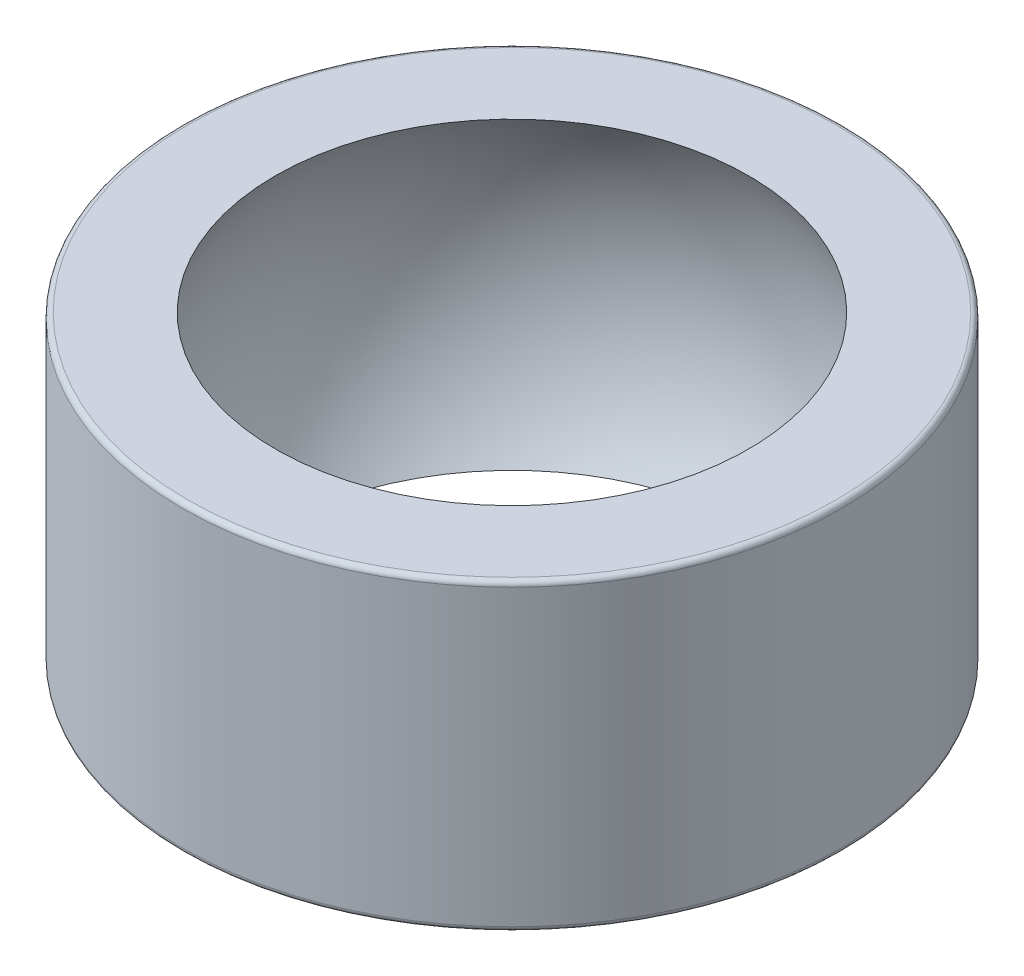
ISO-10303-21;
HEADER;
FILE_DESCRIPTION(('STEP AP214'),'2;1');
FILE_NAME('part.step','',(''),(''),'','','');
FILE_SCHEMA(('AUTOMOTIVE_DESIGN { 1 0 10303 214 1 1 1 1 }'));
ENDSEC;
DATA;
#1=APPLICATION_CONTEXT('core data for automotive mechanical design processes');
#2=APPLICATION_PROTOCOL_DEFINITION('international standard','automotive_design',2000,#1);
#3=PRODUCT_CONTEXT('',#1,'mechanical');
#4=PRODUCT('Part','Part','',(#3));
#5=PRODUCT_RELATED_PRODUCT_CATEGORY('part','',(#4));
#6=PRODUCT_DEFINITION_FORMATION('','',#4);
#7=PRODUCT_DEFINITION_CONTEXT('part definition',#1,'design');
#8=PRODUCT_DEFINITION('design','',#6,#7);
#9=PRODUCT_DEFINITION_SHAPE('','',#8);
#10=(LENGTH_UNIT() NAMED_UNIT(*) SI_UNIT(.MILLI.,.METRE.));
#11=(NAMED_UNIT(*) PLANE_ANGLE_UNIT() SI_UNIT($,.RADIAN.));
#12=(NAMED_UNIT(*) SI_UNIT($,.STERADIAN.) SOLID_ANGLE_UNIT());
#13=UNCERTAINTY_MEASURE_WITH_UNIT(LENGTH_MEASURE(1.E-05),#10,'distance_accuracy_value','');
#14=(GEOMETRIC_REPRESENTATION_CONTEXT(3) GLOBAL_UNCERTAINTY_ASSIGNED_CONTEXT((#13)) GLOBAL_UNIT_ASSIGNED_CONTEXT((#10,
#11,#12)) REPRESENTATION_CONTEXT('',''));
#15=CARTESIAN_POINT('',(0.,0.,0.));
#16=DIRECTION('',(0.,0.,1.));
#17=DIRECTION('',(1.,0.,0.));
#18=AXIS2_PLACEMENT_3D('',#15,#16,#17);
#19=CARTESIAN_POINT('',(0.,6.,0.));
#20=DIRECTION('',(0.,-1.,0.));
#21=DIRECTION('',(0.,0.,-1.));
#22=AXIS2_PLACEMENT_3D('',#19,#20,#21);
#23=CYLINDRICAL_SURFACE('',#22,13.);
#24=CARTESIAN_POINT('',(0.,-5.8,0.));
#25=DIRECTION('',(0.,1.,0.));
#26=DIRECTION('',(0.,0.,1.));
#27=AXIS2_PLACEMENT_3D('',#24,#25,#26);
#28=CIRCLE('',#27,13.);
#29=CARTESIAN_POINT('',(0.,-5.8,13.));
#30=VERTEX_POINT('',#29);
#31=EDGE_CURVE('E41',#30,#30,#28,.T.);
#32=ORIENTED_EDGE('',*,*,#31,.T.);
#33=EDGE_LOOP('',(#32));
#34=FACE_BOUND('',#33,.T.);
#35=CARTESIAN_POINT('',(0.,5.8,0.));
#36=DIRECTION('',(0.,1.,0.));
#37=DIRECTION('',(0.,0.,1.));
#38=AXIS2_PLACEMENT_3D('',#35,#36,#37);
#39=CIRCLE('',#38,13.);
#40=CARTESIAN_POINT('',(0.,5.8,13.));
#41=VERTEX_POINT('',#40);
#42=EDGE_CURVE('E45',#41,#41,#39,.F.);
#43=ORIENTED_EDGE('',*,*,#42,.T.);
#44=EDGE_LOOP('',(#43));
#45=FACE_BOUND('',#44,.T.);
#46=ADVANCED_FACE('F30',(#34,#45),#23,.T.);
#47=CARTESIAN_POINT('',(0.,6.,0.));
#48=DIRECTION('',(0.,1.,0.));
#49=DIRECTION('',(0.,0.,1.));
#50=AXIS2_PLACEMENT_3D('',#47,#48,#49);
#51=PLANE('',#50);
#52=CARTESIAN_POINT('',(0.,6.,0.));
#53=DIRECTION('',(0.,1.,0.));
#54=DIRECTION('',(0.,0.,1.));
#55=AXIS2_PLACEMENT_3D('',#52,#53,#54);
#56=CIRCLE('',#55,12.8);
#57=CARTESIAN_POINT('',(0.,6.,12.8));
#58=VERTEX_POINT('',#57);
#59=EDGE_CURVE('E10',#58,#58,#56,.T.);
#60=ORIENTED_EDGE('',*,*,#59,.T.);
#61=EDGE_LOOP('',(#60));
#62=FACE_BOUND('',#61,.T.);
#63=CARTESIAN_POINT('',(0.,6.,0.));
#64=DIRECTION('',(0.,1.,0.));
#65=DIRECTION('',(0.,0.,1.));
#66=AXIS2_PLACEMENT_3D('',#63,#64,#65);
#67=CIRCLE('',#66,9.33862944976403);
#68=CARTESIAN_POINT('',(-9.33862944976403,6.,0.));
#69=VERTEX_POINT('',#68);
#70=EDGE_CURVE('E50',#69,#69,#67,.T.);
#71=ORIENTED_EDGE('',*,*,#70,.F.);
#72=EDGE_LOOP('',(#71));
#73=FACE_BOUND('',#72,.T.);
#74=ADVANCED_FACE('F60',(#62,#73),#51,.T.);
#75=CARTESIAN_POINT('',(0.,-6.,0.));
#76=DIRECTION('',(0.,1.,0.));
#77=DIRECTION('',(0.,0.,1.));
#78=AXIS2_PLACEMENT_3D('',#75,#76,#77);
#79=PLANE('',#78);
#80=CARTESIAN_POINT('',(0.,-6.,0.));
#81=DIRECTION('',(0.,1.,0.));
#82=DIRECTION('',(0.,0.,1.));
#83=AXIS2_PLACEMENT_3D('',#80,#81,#82);
#84=CIRCLE('',#83,12.8);
#85=CARTESIAN_POINT('',(0.,-6.,12.8));
#86=VERTEX_POINT('',#85);
#87=EDGE_CURVE('E37',#86,#86,#84,.F.);
#88=ORIENTED_EDGE('',*,*,#87,.T.);
#89=EDGE_LOOP('',(#88));
#90=FACE_BOUND('',#89,.T.);
#91=CARTESIAN_POINT('',(0.,-6.,0.));
#92=DIRECTION('',(0.,1.,0.));
#93=DIRECTION('',(0.,0.,1.));
#94=AXIS2_PLACEMENT_3D('',#91,#92,#93);
#95=CIRCLE('',#94,9.33862944976403);
#96=CARTESIAN_POINT('',(-9.33862944976403,-6.,0.));
#97=VERTEX_POINT('',#96);
#98=EDGE_CURVE('E51',#97,#97,#95,.T.);
#99=ORIENTED_EDGE('',*,*,#98,.T.);
#100=EDGE_LOOP('',(#99));
#101=FACE_BOUND('',#100,.T.);
#102=ADVANCED_FACE('F62',(#90,#101),#79,.F.);
#103=CARTESIAN_POINT('',(0.,0.,0.));
#104=DIRECTION('',(0.,-1.,0.));
#105=DIRECTION('',(-1.,0.,0.));
#106=AXIS2_PLACEMENT_3D('',#103,#104,#105);
#107=SPHERICAL_SURFACE('',#106,11.1);
#108=CARTESIAN_POINT('',(-9.33862944976403,6.,0.));
#109=CARTESIAN_POINT('',(-9.41001531016167,5.88889431043099,0.));
#110=CARTESIAN_POINT('',(-9.47941652590914,5.77651358064106,0.));
#111=CARTESIAN_POINT('',(-9.61416533603937,5.54934760873748,0.));
#112=CARTESIAN_POINT('',(-9.67951293042214,5.43456236662383,0.));
#113=CARTESIAN_POINT('',(-9.80607016575862,5.20273293819096,0.));
#114=CARTESIAN_POINT('',(-9.86727980671233,5.08568875187174,0.));
#115=CARTESIAN_POINT('',(-9.98548345769638,4.84949070133113,0.));
#116=CARTESIAN_POINT('',(-10.0424774677267,4.73033683710974,0.));
#117=CARTESIAN_POINT('',(-10.1521771785841,4.49007116450477,0.));
#118=CARTESIAN_POINT('',(-10.2048828794111,4.36895935612118,0.));
#119=CARTESIAN_POINT('',(-10.3059388554391,4.12493208191809,0.));
#120=CARTESIAN_POINT('',(-10.35428913064,4.00201661609858,0.));
#121=CARTESIAN_POINT('',(-10.4465726603908,3.75453859549077,0.));
#122=CARTESIAN_POINT('',(-10.4905059149408,3.62997604070246,0.));
#123=CARTESIAN_POINT('',(-10.5738994419726,3.37936251294451,0.));
#124=CARTESIAN_POINT('',(-10.6133597144544,3.25331153997487,0.));
#125=CARTESIAN_POINT('',(-10.6877570117823,2.9998817414805,0.));
#126=CARTESIAN_POINT('',(-10.7226940366284,2.87250291595576,0.));
#127=CARTESIAN_POINT('',(-10.7880003354185,2.61657966972225,0.));
#128=CARTESIAN_POINT('',(-10.8183696093625,2.48803524901347,0.));
#129=CARTESIAN_POINT('',(-10.8745017214238,2.22994455445644,0.));
#130=CARTESIAN_POINT('',(-10.900264559541,2.10039828060818,0.));
#131=CARTESIAN_POINT('',(-10.9471509828165,1.84046889801607,0.));
#132=CARTESIAN_POINT('',(-10.9682745679748,1.71008578927222,0.));
#133=CARTESIAN_POINT('',(-11.0058555777495,1.44864882110145,0.));
#134=CARTESIAN_POINT('',(-11.022313002366,1.31759496167452,0.));
#135=CARTESIAN_POINT('',(-11.0505407273113,1.05498343076525,0.));
#136=CARTESIAN_POINT('',(-11.0623110276401,0.923425759282917,0.));
#137=CARTESIAN_POINT('',(-11.0811495108019,0.659974184654419,0.));
#138=CARTESIAN_POINT('',(-11.0882176936349,0.528080281508257,0.));
#139=CARTESIAN_POINT('',(-11.0976429382339,0.264124252241397,0.));
#140=CARTESIAN_POINT('',(-11.1,0.132062126120699,0.));
#141=CARTESIAN_POINT('',(-11.1,-0.132062126120699,0.));
#142=CARTESIAN_POINT('',(-11.0976429382339,-0.264124252241397,0.));
#143=CARTESIAN_POINT('',(-11.0882176936349,-0.528080281508257,0.));
#144=CARTESIAN_POINT('',(-11.0811495108019,-0.659974184654419,0.));
#145=CARTESIAN_POINT('',(-11.0623110276401,-0.923425759282918,0.));
#146=CARTESIAN_POINT('',(-11.0505407273113,-1.05498343076525,0.));
#147=CARTESIAN_POINT('',(-11.022313002366,-1.31759496167452,0.));
#148=CARTESIAN_POINT('',(-11.0058555777495,-1.44864882110145,0.));
#149=CARTESIAN_POINT('',(-10.9682745679748,-1.71008578927222,0.));
#150=CARTESIAN_POINT('',(-10.9471509828165,-1.84046889801607,0.));
#151=CARTESIAN_POINT('',(-10.900264559541,-2.10039828060818,0.));
#152=CARTESIAN_POINT('',(-10.8745017214238,-2.22994455445643,0.));
#153=CARTESIAN_POINT('',(-10.8183696093625,-2.48803524901347,0.));
#154=CARTESIAN_POINT('',(-10.7880003354185,-2.61657966972225,0.));
#155=CARTESIAN_POINT('',(-10.7226940366284,-2.87250291595576,0.));
#156=CARTESIAN_POINT('',(-10.6877570117823,-2.9998817414805,0.));
#157=CARTESIAN_POINT('',(-10.6133597144544,-3.25331153997487,0.));
#158=CARTESIAN_POINT('',(-10.5738994419726,-3.37936251294451,0.));
#159=CARTESIAN_POINT('',(-10.4905059149408,-3.62997604070246,0.));
#160=CARTESIAN_POINT('',(-10.4465726603908,-3.75453859549077,0.));
#161=CARTESIAN_POINT('',(-10.35428913064,-4.00201661609858,0.));
#162=CARTESIAN_POINT('',(-10.3059388554391,-4.12493208191809,0.));
#163=CARTESIAN_POINT('',(-10.2048828794111,-4.36895935612118,0.));
#164=CARTESIAN_POINT('',(-10.1521771785841,-4.49007116450477,0.));
#165=CARTESIAN_POINT('',(-10.0424774677267,-4.73033683710974,0.));
#166=CARTESIAN_POINT('',(-9.98548345769638,-4.84949070133113,0.));
#167=CARTESIAN_POINT('',(-9.86727980671233,-5.08568875187174,0.));
#168=CARTESIAN_POINT('',(-9.80607016575862,-5.20273293819096,0.));
#169=CARTESIAN_POINT('',(-9.67951293042214,-5.43456236662383,0.));
#170=CARTESIAN_POINT('',(-9.61416533603937,-5.54934760873748,0.));
#171=CARTESIAN_POINT('',(-9.47941652590914,-5.77651358064106,0.));
#172=CARTESIAN_POINT('',(-9.41001531016167,-5.88889431043099,0.));
#173=CARTESIAN_POINT('',(-9.33862944976403,-6.,0.));
#174=B_SPLINE_CURVE_WITH_KNOTS('',3,(#108,#109,#110,#111,#112,#113,#114,#115,#116,#117,#118,
#119,#120,#121,#122,#123,#124,#125,#126,#127,#128,#129,#130,#131,#132,#133,#134,#135,#136,#137,
#138,#139,#140,#141,#142,#143,#144,#145,#146,#147,#148,#149,#150,#151,#152,#153,#154,#155,#156,
#157,#158,#159,#160,#161,#162,#163,#164,#165,#166,#167,#168,#169,#170,#171,#172,#173),
.UNSPECIFIED.,.F.,.F.,(4,2,2,2,2,2,2,2,2,2,2,2,2,2,2,2,2,2,2,2,2,2,2,2,2,2,2,2,2,2,2,2,4),(0.,
0.396165352165184,0.792330704330368,1.18849605649555,1.58466140866073,1.98082676082592,
2.3769921129911,2.77315746515628,3.16932281732147,3.56548816948665,3.96165352165184,
4.35781887381702,4.7539842259822,5.15014957814739,5.54631493031257,5.94248028247775,
6.33864563464294,6.73481098680812,7.1309763389733,7.52714169113849,7.92330704330367,
8.31947239546886,8.71563774763404,9.11180309979922,9.50796845196441,9.90413380412959,
10.3002991562948,10.69646450846,11.0926298606251,11.4887952127903,11.8849605649555,
12.2811259171207,12.6772912692859),.UNSPECIFIED.);
#175=EDGE_CURVE('BSEAM57',#69,#97,#174,.T.);
#176=ORIENTED_EDGE('',*,*,#70,.T.);
#177=ORIENTED_EDGE('',*,*,#98,.F.);
#178=ORIENTED_EDGE('',*,*,#175,.T.);
#179=ORIENTED_EDGE('',*,*,#175,.F.);
#180=EDGE_LOOP('',(#176,#178,#177,#179));
#181=FACE_BOUND('',#180,.T.);
#182=ADVANCED_FACE('F57',(#181),#107,.F.);
#183=CARTESIAN_POINT('',(0.,-5.8,0.));
#184=DIRECTION('',(0.,1.,0.));
#185=DIRECTION('',(0.,0.,1.));
#186=AXIS2_PLACEMENT_3D('',#183,#184,#185);
#187=TOROIDAL_SURFACE('',#186,12.8,0.2);
#188=ORIENTED_EDGE('',*,*,#87,.F.);
#189=EDGE_LOOP('',(#188));
#190=FACE_BOUND('',#189,.T.);
#191=ORIENTED_EDGE('',*,*,#31,.F.);
#192=EDGE_LOOP('',(#191));
#193=FACE_BOUND('',#192,.T.);
#194=ADVANCED_FACE('F72',(#190,#193),#187,.T.);
#195=CARTESIAN_POINT('',(0.,5.8,0.));
#196=DIRECTION('',(0.,1.,0.));
#197=DIRECTION('',(0.,0.,1.));
#198=AXIS2_PLACEMENT_3D('',#195,#196,#197);
#199=TOROIDAL_SURFACE('',#198,12.8,0.2);
#200=ORIENTED_EDGE('',*,*,#42,.F.);
#201=EDGE_LOOP('',(#200));
#202=FACE_BOUND('',#201,.T.);
#203=ORIENTED_EDGE('',*,*,#59,.F.);
#204=EDGE_LOOP('',(#203));
#205=FACE_BOUND('',#204,.T.);
#206=ADVANCED_FACE('F32',(#202,#205),#199,.T.);
#207=CLOSED_SHELL('',(#46,#74,#102,#182,#194,#206));
#208=MANIFOLD_SOLID_BREP('B2',#207);
#209=ADVANCED_BREP_SHAPE_REPRESENTATION('',(#18,#208),#14);
#210=SHAPE_DEFINITION_REPRESENTATION(#9,#209);
ENDSEC;
END-ISO-10303-21;
